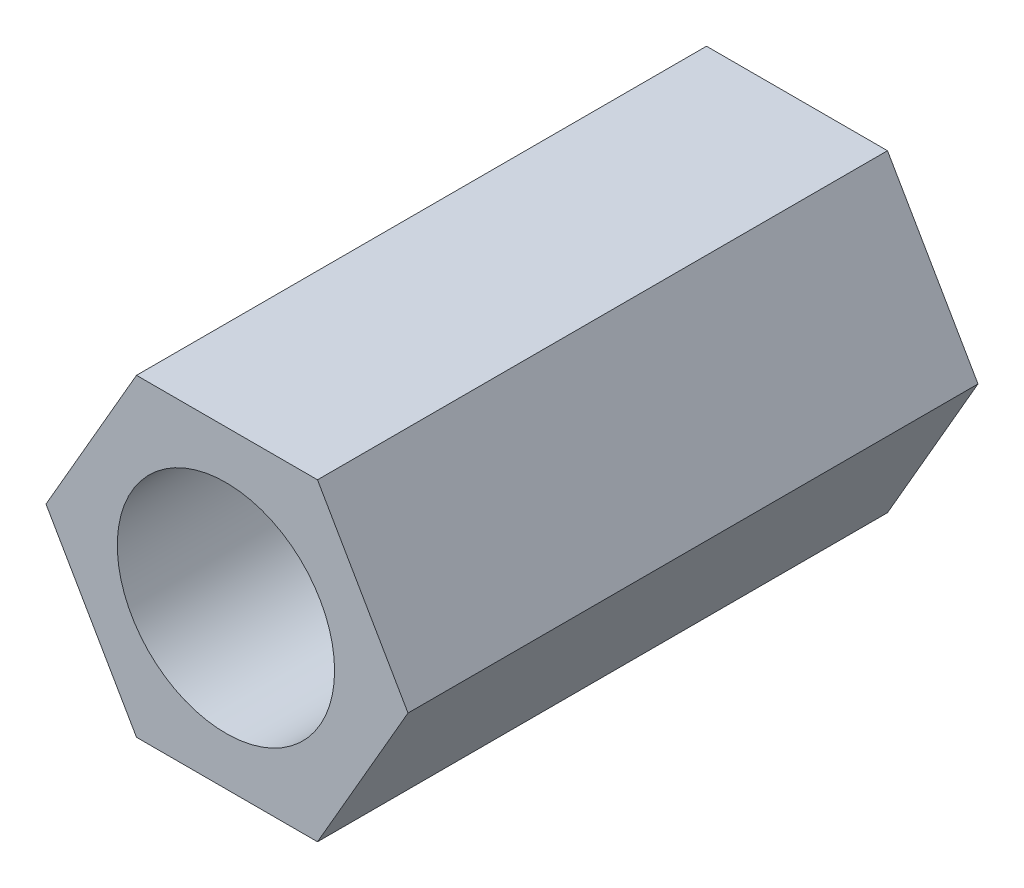
ISO-10303-21;
HEADER;
FILE_DESCRIPTION(('STEP AP214'),'2;1');
FILE_NAME('part.step','',(''),(''),'','','');
FILE_SCHEMA(('AUTOMOTIVE_DESIGN { 1 0 10303 214 1 1 1 1 }'));
ENDSEC;
DATA;
#1=APPLICATION_CONTEXT('core data for automotive mechanical design processes');
#2=APPLICATION_PROTOCOL_DEFINITION('international standard','automotive_design',2000,#1);
#3=PRODUCT_CONTEXT('',#1,'mechanical');
#4=PRODUCT('Part','Part','',(#3));
#5=PRODUCT_RELATED_PRODUCT_CATEGORY('part','',(#4));
#6=PRODUCT_DEFINITION_FORMATION('','',#4);
#7=PRODUCT_DEFINITION_CONTEXT('part definition',#1,'design');
#8=PRODUCT_DEFINITION('design','',#6,#7);
#9=PRODUCT_DEFINITION_SHAPE('','',#8);
#10=(LENGTH_UNIT() NAMED_UNIT(*) SI_UNIT(.MILLI.,.METRE.));
#11=(NAMED_UNIT(*) PLANE_ANGLE_UNIT() SI_UNIT($,.RADIAN.));
#12=(NAMED_UNIT(*) SI_UNIT($,.STERADIAN.) SOLID_ANGLE_UNIT());
#13=UNCERTAINTY_MEASURE_WITH_UNIT(LENGTH_MEASURE(1.E-05),#10,'distance_accuracy_value','');
#14=(GEOMETRIC_REPRESENTATION_CONTEXT(3) GLOBAL_UNCERTAINTY_ASSIGNED_CONTEXT((#13)) GLOBAL_UNIT_ASSIGNED_CONTEXT((#10,
#11,#12)) REPRESENTATION_CONTEXT('',''));
#15=CARTESIAN_POINT('',(0.,0.,0.));
#16=DIRECTION('',(0.,0.,1.));
#17=DIRECTION('',(1.,0.,0.));
#18=AXIS2_PLACEMENT_3D('',#15,#16,#17);
#19=CARTESIAN_POINT('',(-6.3508529610859,10.9999999999999,0.));
#20=DIRECTION('',(-0.866025403784442,0.499999999999995,0.));
#21=DIRECTION('',(-0.499999999999995,-0.866025403784442,0.));
#22=AXIS2_PLACEMENT_3D('',#19,#20,#21);
#23=PLANE('',#22);
#24=DIRECTION('',(-0.499999999999995,-0.866025403784441,0.));
#25=VECTOR('',#24,1.);
#26=CARTESIAN_POINT('',(-6.3508529610859,10.9999999999999,40.));
#27=LINE('',#26,#25);
#28=CARTESIAN_POINT('',(-6.3508529610859,10.9999999999999,40.));
#29=VERTEX_POINT('',#28);
#30=CARTESIAN_POINT('',(-12.7017059221717,0.,40.));
#31=VERTEX_POINT('',#30);
#32=EDGE_CURVE('E121',#29,#31,#27,.T.);
#33=ORIENTED_EDGE('',*,*,#32,.F.);
#34=DIRECTION('',(0.,0.,1.));
#35=VECTOR('',#34,1.);
#36=CARTESIAN_POINT('',(-6.3508529610859,10.9999999999999,0.));
#37=LINE('',#36,#35);
#38=CARTESIAN_POINT('',(-6.3508529610859,10.9999999999999,0.));
#39=VERTEX_POINT('',#38);
#40=EDGE_CURVE('E11',#39,#29,#37,.T.);
#41=ORIENTED_EDGE('',*,*,#40,.F.);
#42=DIRECTION('',(-0.499999999999995,-0.866025403784441,0.));
#43=VECTOR('',#42,1.);
#44=CARTESIAN_POINT('',(-6.3508529610859,10.9999999999999,0.));
#45=LINE('',#44,#43);
#46=CARTESIAN_POINT('',(-12.7017059221717,0.,0.));
#47=VERTEX_POINT('',#46);
#48=EDGE_CURVE('E136',#39,#47,#45,.T.);
#49=ORIENTED_EDGE('',*,*,#48,.T.);
#50=DIRECTION('',(0.,0.,1.));
#51=VECTOR('',#50,1.);
#52=CARTESIAN_POINT('',(-12.7017059221717,0.,0.));
#53=LINE('',#52,#51);
#54=EDGE_CURVE('E39',#47,#31,#53,.T.);
#55=ORIENTED_EDGE('',*,*,#54,.T.);
#56=EDGE_LOOP('',(#33,#41,#49,#55));
#57=FACE_BOUND('',#56,.T.);
#58=ADVANCED_FACE('F36',(#57),#23,.T.);
#59=CARTESIAN_POINT('',(6.35085296108583,11.,0.));
#60=DIRECTION('',(0.,1.,0.));
#61=DIRECTION('',(-1.,0.,0.));
#62=AXIS2_PLACEMENT_3D('',#59,#60,#61);
#63=PLANE('',#62);
#64=DIRECTION('',(-1.,0.,0.));
#65=VECTOR('',#64,1.);
#66=CARTESIAN_POINT('',(6.35085296108583,11.,40.));
#67=LINE('',#66,#65);
#68=CARTESIAN_POINT('',(6.35085296108583,11.,40.));
#69=VERTEX_POINT('',#68);
#70=EDGE_CURVE('E134',#69,#29,#67,.T.);
#71=ORIENTED_EDGE('',*,*,#70,.F.);
#72=DIRECTION('',(0.,0.,1.));
#73=VECTOR('',#72,1.);
#74=CARTESIAN_POINT('',(6.35085296108583,11.,0.));
#75=LINE('',#74,#73);
#76=CARTESIAN_POINT('',(6.35085296108583,11.,0.));
#77=VERTEX_POINT('',#76);
#78=EDGE_CURVE('E45',#77,#69,#75,.T.);
#79=ORIENTED_EDGE('',*,*,#78,.F.);
#80=DIRECTION('',(-1.,0.,0.));
#81=VECTOR('',#80,1.);
#82=CARTESIAN_POINT('',(6.35085296108583,11.,0.));
#83=LINE('',#82,#81);
#84=EDGE_CURVE('E111',#77,#39,#83,.T.);
#85=ORIENTED_EDGE('',*,*,#84,.T.);
#86=ORIENTED_EDGE('',*,*,#40,.T.);
#87=EDGE_LOOP('',(#71,#79,#85,#86));
#88=FACE_BOUND('',#87,.T.);
#89=ADVANCED_FACE('F144',(#88),#63,.T.);
#90=CARTESIAN_POINT('',(12.7017059221717,0.,0.));
#91=DIRECTION('',(0.866025403784438,0.500000000000001,0.));
#92=DIRECTION('',(-0.500000000000001,0.866025403784438,0.));
#93=AXIS2_PLACEMENT_3D('',#90,#91,#92);
#94=PLANE('',#93);
#95=DIRECTION('',(-0.500000000000001,0.866025403784438,0.));
#96=VECTOR('',#95,1.);
#97=CARTESIAN_POINT('',(12.7017059221717,0.,40.));
#98=LINE('',#97,#96);
#99=CARTESIAN_POINT('',(12.7017059221717,0.,40.));
#100=VERTEX_POINT('',#99);
#101=EDGE_CURVE('E98',#100,#69,#98,.T.);
#102=ORIENTED_EDGE('',*,*,#101,.F.);
#103=DIRECTION('',(0.,0.,1.));
#104=VECTOR('',#103,1.);
#105=CARTESIAN_POINT('',(12.7017059221717,0.,0.));
#106=LINE('',#105,#104);
#107=CARTESIAN_POINT('',(12.7017059221717,0.,0.));
#108=VERTEX_POINT('',#107);
#109=EDGE_CURVE('E93',#108,#100,#106,.T.);
#110=ORIENTED_EDGE('',*,*,#109,.F.);
#111=DIRECTION('',(-0.500000000000001,0.866025403784438,0.));
#112=VECTOR('',#111,1.);
#113=CARTESIAN_POINT('',(12.7017059221717,0.,0.));
#114=LINE('',#113,#112);
#115=EDGE_CURVE('E96',#108,#77,#114,.T.);
#116=ORIENTED_EDGE('',*,*,#115,.T.);
#117=ORIENTED_EDGE('',*,*,#78,.T.);
#118=EDGE_LOOP('',(#102,#110,#116,#117));
#119=FACE_BOUND('',#118,.T.);
#120=ADVANCED_FACE('F95',(#119),#94,.T.);
#121=CARTESIAN_POINT('',(6.35085296108595,-11.,0.));
#122=DIRECTION('',(0.866025403784442,-0.499999999999995,0.));
#123=DIRECTION('',(0.499999999999995,0.866025403784442,0.));
#124=AXIS2_PLACEMENT_3D('',#121,#122,#123);
#125=PLANE('',#124);
#126=DIRECTION('',(0.499999999999995,0.866025403784442,0.));
#127=VECTOR('',#126,1.);
#128=CARTESIAN_POINT('',(6.35085296108595,-11.,40.));
#129=LINE('',#128,#127);
#130=CARTESIAN_POINT('',(6.35085296108595,-11.,40.));
#131=VERTEX_POINT('',#130);
#132=EDGE_CURVE('E131',#131,#100,#129,.T.);
#133=ORIENTED_EDGE('',*,*,#132,.F.);
#134=DIRECTION('',(0.,0.,1.));
#135=VECTOR('',#134,1.);
#136=CARTESIAN_POINT('',(6.35085296108595,-11.,0.));
#137=LINE('',#136,#135);
#138=CARTESIAN_POINT('',(6.35085296108595,-11.,0.));
#139=VERTEX_POINT('',#138);
#140=EDGE_CURVE('E103',#139,#131,#137,.T.);
#141=ORIENTED_EDGE('',*,*,#140,.F.);
#142=DIRECTION('',(0.499999999999995,0.866025403784442,0.));
#143=VECTOR('',#142,1.);
#144=CARTESIAN_POINT('',(6.35085296108595,-11.,0.));
#145=LINE('',#144,#143);
#146=EDGE_CURVE('E109',#139,#108,#145,.T.);
#147=ORIENTED_EDGE('',*,*,#146,.T.);
#148=ORIENTED_EDGE('',*,*,#109,.T.);
#149=EDGE_LOOP('',(#133,#141,#147,#148));
#150=FACE_BOUND('',#149,.T.);
#151=ADVANCED_FACE('F113',(#150),#125,.T.);
#152=CARTESIAN_POINT('',(-6.35085296108576,-11.,0.));
#153=DIRECTION('',(0.,-1.,0.));
#154=DIRECTION('',(1.,0.,0.));
#155=AXIS2_PLACEMENT_3D('',#152,#153,#154);
#156=PLANE('',#155);
#157=DIRECTION('',(1.,0.,0.));
#158=VECTOR('',#157,1.);
#159=CARTESIAN_POINT('',(-6.35085296108576,-11.,40.));
#160=LINE('',#159,#158);
#161=CARTESIAN_POINT('',(-6.35085296108576,-11.,40.));
#162=VERTEX_POINT('',#161);
#163=EDGE_CURVE('E128',#162,#131,#160,.T.);
#164=ORIENTED_EDGE('',*,*,#163,.F.);
#165=DIRECTION('',(0.,0.,1.));
#166=VECTOR('',#165,1.);
#167=CARTESIAN_POINT('',(-6.35085296108576,-11.,0.));
#168=LINE('',#167,#166);
#169=CARTESIAN_POINT('',(-6.35085296108576,-11.,0.));
#170=VERTEX_POINT('',#169);
#171=EDGE_CURVE('E139',#170,#162,#168,.T.);
#172=ORIENTED_EDGE('',*,*,#171,.F.);
#173=DIRECTION('',(1.,0.,0.));
#174=VECTOR('',#173,1.);
#175=CARTESIAN_POINT('',(-6.35085296108576,-11.,0.));
#176=LINE('',#175,#174);
#177=EDGE_CURVE('E114',#170,#139,#176,.T.);
#178=ORIENTED_EDGE('',*,*,#177,.T.);
#179=ORIENTED_EDGE('',*,*,#140,.T.);
#180=EDGE_LOOP('',(#164,#172,#178,#179));
#181=FACE_BOUND('',#180,.T.);
#182=ADVANCED_FACE('F157',(#181),#156,.T.);
#183=CARTESIAN_POINT('',(-12.7017059221717,0.,0.));
#184=DIRECTION('',(-0.866025403784435,-0.500000000000007,0.));
#185=DIRECTION('',(0.500000000000007,-0.866025403784435,0.));
#186=AXIS2_PLACEMENT_3D('',#183,#184,#185);
#187=PLANE('',#186);
#188=DIRECTION('',(0.500000000000007,-0.866025403784435,0.));
#189=VECTOR('',#188,1.);
#190=CARTESIAN_POINT('',(-12.7017059221717,0.,40.));
#191=LINE('',#190,#189);
#192=EDGE_CURVE('E124',#31,#162,#191,.T.);
#193=ORIENTED_EDGE('',*,*,#192,.F.);
#194=ORIENTED_EDGE('',*,*,#54,.F.);
#195=DIRECTION('',(0.500000000000007,-0.866025403784435,0.));
#196=VECTOR('',#195,1.);
#197=CARTESIAN_POINT('',(-12.7017059221717,0.,0.));
#198=LINE('',#197,#196);
#199=EDGE_CURVE('E116',#47,#170,#198,.T.);
#200=ORIENTED_EDGE('',*,*,#199,.T.);
#201=ORIENTED_EDGE('',*,*,#171,.T.);
#202=EDGE_LOOP('',(#193,#194,#200,#201));
#203=FACE_BOUND('',#202,.T.);
#204=ADVANCED_FACE('F141',(#203),#187,.T.);
#205=CARTESIAN_POINT('',(0.,0.,0.));
#206=DIRECTION('',(0.,0.,1.));
#207=DIRECTION('',(1.,0.,0.));
#208=AXIS2_PLACEMENT_3D('',#205,#206,#207);
#209=PLANE('',#208);
#210=CARTESIAN_POINT('',(-0.0748247013808087,0.,0.));
#211=DIRECTION('',(0.,0.,1.));
#212=DIRECTION('',(1.,0.,0.));
#213=AXIS2_PLACEMENT_3D('',#210,#211,#212);
#214=CIRCLE('',#213,5.99045948307911);
#215=CARTESIAN_POINT('',(5.9156347816983,0.,0.));
#216=VERTEX_POINT('',#215);
#217=EDGE_CURVE('E212',#216,#216,#214,.T.);
#218=ORIENTED_EDGE('',*,*,#217,.T.);
#219=EDGE_LOOP('',(#218));
#220=FACE_BOUND('',#219,.T.);
#221=ORIENTED_EDGE('',*,*,#48,.F.);
#222=ORIENTED_EDGE('',*,*,#84,.F.);
#223=ORIENTED_EDGE('',*,*,#115,.F.);
#224=ORIENTED_EDGE('',*,*,#146,.F.);
#225=ORIENTED_EDGE('',*,*,#177,.F.);
#226=ORIENTED_EDGE('',*,*,#199,.F.);
#227=EDGE_LOOP('',(#221,#222,#223,#224,#225,#226));
#228=FACE_BOUND('',#227,.T.);
#229=ADVANCED_FACE('F107',(#220,#228),#209,.F.);
#230=CARTESIAN_POINT('',(0.,0.,40.));
#231=DIRECTION('',(0.,0.,1.));
#232=DIRECTION('',(1.,0.,0.));
#233=AXIS2_PLACEMENT_3D('',#230,#231,#232);
#234=PLANE('',#233);
#235=CARTESIAN_POINT('',(-0.0748247013808087,0.,40.));
#236=DIRECTION('',(0.,0.,1.));
#237=DIRECTION('',(1.,0.,0.));
#238=AXIS2_PLACEMENT_3D('',#235,#236,#237);
#239=CIRCLE('',#238,7.62482470138081);
#240=CARTESIAN_POINT('',(7.55,0.,40.));
#241=VERTEX_POINT('',#240);
#242=EDGE_CURVE('E206',#241,#241,#239,.T.);
#243=ORIENTED_EDGE('',*,*,#242,.F.);
#244=EDGE_LOOP('',(#243));
#245=FACE_BOUND('',#244,.T.);
#246=ORIENTED_EDGE('',*,*,#32,.T.);
#247=ORIENTED_EDGE('',*,*,#192,.T.);
#248=ORIENTED_EDGE('',*,*,#163,.T.);
#249=ORIENTED_EDGE('',*,*,#132,.T.);
#250=ORIENTED_EDGE('',*,*,#101,.T.);
#251=ORIENTED_EDGE('',*,*,#70,.T.);
#252=EDGE_LOOP('',(#246,#247,#248,#249,#250,#251));
#253=FACE_BOUND('',#252,.T.);
#254=ADVANCED_FACE('F143',(#245,#253),#234,.T.);
#255=CARTESIAN_POINT('',(-0.0748247013808087,0.,21.69));
#256=DIRECTION('',(0.,0.,1.));
#257=DIRECTION('',(1.,0.,0.));
#258=AXIS2_PLACEMENT_3D('',#255,#256,#257);
#259=TOROIDAL_SURFACE('',#258,3.07482470138081,2.);
#260=CARTESIAN_POINT('',(-0.0748247013808087,0.,19.8819693033579));
#261=DIRECTION('',(0.,0.,1.));
#262=DIRECTION('',(1.,0.,0.));
#263=AXIS2_PLACEMENT_3D('',#260,#261,#262);
#264=CIRCLE('',#263,3.92982470138081);
#265=CARTESIAN_POINT('',(3.855,0.,19.8819693033579));
#266=VERTEX_POINT('',#265);
#267=EDGE_CURVE('E125',#266,#266,#264,.T.);
#268=ORIENTED_EDGE('',*,*,#267,.F.);
#269=EDGE_LOOP('',(#268));
#270=FACE_BOUND('',#269,.T.);
#271=CARTESIAN_POINT('',(-0.0748247013808087,0.,21.69));
#272=DIRECTION('',(0.,0.,1.));
#273=DIRECTION('',(1.,0.,0.));
#274=AXIS2_PLACEMENT_3D('',#271,#272,#273);
#275=CIRCLE('',#274,5.07482470138081);
#276=CARTESIAN_POINT('',(5.,0.,21.69));
#277=VERTEX_POINT('',#276);
#278=EDGE_CURVE('E199',#277,#277,#275,.T.);
#279=ORIENTED_EDGE('',*,*,#278,.T.);
#280=EDGE_LOOP('',(#279));
#281=FACE_BOUND('',#280,.T.);
#282=ADVANCED_FACE('F168',(#270,#281),#259,.F.);
#283=CARTESIAN_POINT('',(-0.0748247013808087,0.,17.0704815700795));
#284=DIRECTION('',(0.,0.,1.));
#285=DIRECTION('',(1.,0.,0.));
#286=AXIS2_PLACEMENT_3D('',#283,#284,#285);
#287=TOROIDAL_SURFACE('',#286,5.25934970138081,3.11);
#288=CARTESIAN_POINT('',(-0.0748247013808087,0.,15.872910621726));
#289=DIRECTION('',(0.,0.,1.));
#290=DIRECTION('',(1.,0.,0.));
#291=AXIS2_PLACEMENT_3D('',#288,#289,#290);
#292=CIRCLE('',#291,2.38917134043183);
#293=CARTESIAN_POINT('',(2.31434663905102,0.,15.872910621726));
#294=VERTEX_POINT('',#293);
#295=EDGE_CURVE('E214',#294,#294,#292,.T.);
#296=ORIENTED_EDGE('',*,*,#295,.F.);
#297=EDGE_LOOP('',(#296));
#298=FACE_BOUND('',#297,.T.);
#299=ORIENTED_EDGE('',*,*,#267,.T.);
#300=EDGE_LOOP('',(#299));
#301=FACE_BOUND('',#300,.T.);
#302=ADVANCED_FACE('F174',(#298,#301),#287,.T.);
#303=CARTESIAN_POINT('',(-0.0748247013808087,0.,-2.41796399138989));
#304=DIRECTION('',(0.,0.,1.));
#305=DIRECTION('',(1.,0.,0.));
#306=AXIS2_PLACEMENT_3D('',#303,#304,#305);
#307=DEGENERATE_TOROIDAL_SURFACE('',#306,41.4479579666666,47.5,.F.);
#308=ORIENTED_EDGE('',*,*,#217,.F.);
#309=EDGE_LOOP('',(#308));
#310=FACE_BOUND('',#309,.T.);
#311=ORIENTED_EDGE('',*,*,#295,.T.);
#312=EDGE_LOOP('',(#311));
#313=FACE_BOUND('',#312,.T.);
#314=ADVANCED_FACE('F178',(#310,#313),#307,.T.);
#315=CARTESIAN_POINT('',(-0.0748247013808087,0.,0.317458212434539));
#316=DIRECTION('',(0.,0.,1.));
#317=DIRECTION('',(1.,0.,0.));
#318=AXIS2_PLACEMENT_3D('',#315,#316,#317);
#319=CYLINDRICAL_SURFACE('',#318,7.62482470138081);
#320=CARTESIAN_POINT('',(-0.0748247013808087,0.,25.17));
#321=DIRECTION('',(0.,0.,1.));
#322=DIRECTION('',(1.,0.,0.));
#323=AXIS2_PLACEMENT_3D('',#320,#321,#322);
#324=CIRCLE('',#323,7.62482470138081);
#325=CARTESIAN_POINT('',(7.55,0.,25.17));
#326=VERTEX_POINT('',#325);
#327=EDGE_CURVE('E203',#326,#326,#324,.T.);
#328=ORIENTED_EDGE('',*,*,#327,.F.);
#329=EDGE_LOOP('',(#328));
#330=FACE_BOUND('',#329,.T.);
#331=ORIENTED_EDGE('',*,*,#242,.T.);
#332=EDGE_LOOP('',(#331));
#333=FACE_BOUND('',#332,.T.);
#334=ADVANCED_FACE('F182',(#330,#333),#319,.F.);
#335=CARTESIAN_POINT('',(7.55,0.,25.17));
#336=DIRECTION('',(0.,0.,-1.));
#337=DIRECTION('',(-1.,0.,0.));
#338=AXIS2_PLACEMENT_3D('',#335,#336,#337);
#339=PLANE('',#338);
#340=CARTESIAN_POINT('',(-0.0748247013808087,0.,25.17));
#341=DIRECTION('',(0.,0.,1.));
#342=DIRECTION('',(1.,0.,0.));
#343=AXIS2_PLACEMENT_3D('',#340,#341,#342);
#344=CIRCLE('',#343,5.07482470138081);
#345=CARTESIAN_POINT('',(5.,0.,25.17));
#346=VERTEX_POINT('',#345);
#347=EDGE_CURVE('E202',#346,#346,#344,.T.);
#348=ORIENTED_EDGE('',*,*,#347,.F.);
#349=EDGE_LOOP('',(#348));
#350=FACE_BOUND('',#349,.T.);
#351=ORIENTED_EDGE('',*,*,#327,.T.);
#352=EDGE_LOOP('',(#351));
#353=FACE_BOUND('',#352,.T.);
#354=ADVANCED_FACE('F186',(#350,#353),#339,.F.);
#355=CARTESIAN_POINT('',(-0.0748247013808087,0.,0.317458212434539));
#356=DIRECTION('',(0.,0.,1.));
#357=DIRECTION('',(1.,0.,0.));
#358=AXIS2_PLACEMENT_3D('',#355,#356,#357);
#359=CYLINDRICAL_SURFACE('',#358,5.07482470138081);
#360=ORIENTED_EDGE('',*,*,#278,.F.);
#361=EDGE_LOOP('',(#360));
#362=FACE_BOUND('',#361,.T.);
#363=ORIENTED_EDGE('',*,*,#347,.T.);
#364=EDGE_LOOP('',(#363));
#365=FACE_BOUND('',#364,.T.);
#366=ADVANCED_FACE('F190',(#362,#365),#359,.F.);
#367=CLOSED_SHELL('',(#58,#89,#120,#151,#182,#204,#229,#254,#282,#302,#314,#334,#354,#366));
#368=MANIFOLD_SOLID_BREP('B2',#367);
#369=ADVANCED_BREP_SHAPE_REPRESENTATION('',(#18,#368),#14);
#370=SHAPE_DEFINITION_REPRESENTATION(#9,#369);
ENDSEC;
END-ISO-10303-21;
